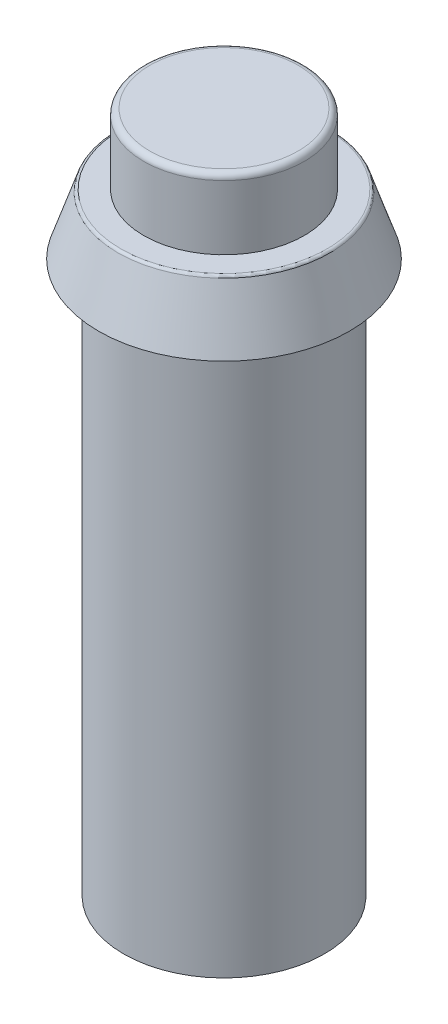
ISO-10303-21;
HEADER;
FILE_DESCRIPTION(('STEP AP214'),'2;1');
FILE_NAME('part.step','',(''),(''),'','','');
FILE_SCHEMA(('AUTOMOTIVE_DESIGN { 1 0 10303 214 1 1 1 1 }'));
ENDSEC;
DATA;
#1=APPLICATION_CONTEXT('core data for automotive mechanical design processes');
#2=APPLICATION_PROTOCOL_DEFINITION('international standard','automotive_design',2000,#1);
#3=PRODUCT_CONTEXT('',#1,'mechanical');
#4=PRODUCT('Part','Part','',(#3));
#5=PRODUCT_RELATED_PRODUCT_CATEGORY('part','',(#4));
#6=PRODUCT_DEFINITION_FORMATION('','',#4);
#7=PRODUCT_DEFINITION_CONTEXT('part definition',#1,'design');
#8=PRODUCT_DEFINITION('design','',#6,#7);
#9=PRODUCT_DEFINITION_SHAPE('','',#8);
#10=(LENGTH_UNIT() NAMED_UNIT(*) SI_UNIT(.MILLI.,.METRE.));
#11=(NAMED_UNIT(*) PLANE_ANGLE_UNIT() SI_UNIT($,.RADIAN.));
#12=(NAMED_UNIT(*) SI_UNIT($,.STERADIAN.) SOLID_ANGLE_UNIT());
#13=UNCERTAINTY_MEASURE_WITH_UNIT(LENGTH_MEASURE(1.E-05),#10,'distance_accuracy_value','');
#14=(GEOMETRIC_REPRESENTATION_CONTEXT(3) GLOBAL_UNCERTAINTY_ASSIGNED_CONTEXT((#13)) GLOBAL_UNIT_ASSIGNED_CONTEXT((#10,
#11,#12)) REPRESENTATION_CONTEXT('',''));
#15=CARTESIAN_POINT('',(0.,0.,0.));
#16=DIRECTION('',(0.,0.,1.));
#17=DIRECTION('',(1.,0.,0.));
#18=AXIS2_PLACEMENT_3D('',#15,#16,#17);
#19=CARTESIAN_POINT('',(0.,27.5,0.));
#20=DIRECTION('',(0.,-1.,0.));
#21=DIRECTION('',(0.,0.,-1.));
#22=AXIS2_PLACEMENT_3D('',#19,#20,#21);
#23=CYLINDRICAL_SURFACE('',#22,5.);
#24=CARTESIAN_POINT('',(0.,27.5,0.));
#25=DIRECTION('',(0.,1.,0.));
#26=DIRECTION('',(0.,0.,1.));
#27=AXIS2_PLACEMENT_3D('',#24,#25,#26);
#28=CIRCLE('',#27,5.);
#29=CARTESIAN_POINT('',(0.,27.5,5.));
#30=VERTEX_POINT('',#29);
#31=EDGE_CURVE('E72',#30,#30,#28,.T.);
#32=ORIENTED_EDGE('',*,*,#31,.F.);
#33=EDGE_LOOP('',(#32));
#34=FACE_BOUND('',#33,.T.);
#35=CARTESIAN_POINT('',(0.,0.,0.));
#36=DIRECTION('',(0.,1.,0.));
#37=DIRECTION('',(0.,0.,1.));
#38=AXIS2_PLACEMENT_3D('',#35,#36,#37);
#39=CIRCLE('',#38,5.);
#40=CARTESIAN_POINT('',(0.,0.,5.));
#41=VERTEX_POINT('',#40);
#42=EDGE_CURVE('E68',#41,#41,#39,.T.);
#43=ORIENTED_EDGE('',*,*,#42,.T.);
#44=EDGE_LOOP('',(#43));
#45=FACE_BOUND('',#44,.T.);
#46=ADVANCED_FACE('F43',(#34,#45),#23,.T.);
#47=CARTESIAN_POINT('',(0.,0.,0.));
#48=DIRECTION('',(0.,1.,0.));
#49=DIRECTION('',(0.,0.,1.));
#50=AXIS2_PLACEMENT_3D('',#47,#48,#49);
#51=PLANE('',#50);
#52=ORIENTED_EDGE('',*,*,#42,.F.);
#53=EDGE_LOOP('',(#52));
#54=FACE_BOUND('',#53,.T.);
#55=ADVANCED_FACE('F89',(#54),#51,.F.);
#56=CARTESIAN_POINT('',(0.,30.5,0.));
#57=DIRECTION('',(0.,1.,0.));
#58=DIRECTION('',(0.,0.,1.));
#59=AXIS2_PLACEMENT_3D('',#56,#57,#58);
#60=PLANE('',#59);
#61=CARTESIAN_POINT('',(0.,30.5,0.));
#62=DIRECTION('',(0.,1.,0.));
#63=DIRECTION('',(0.,0.,1.));
#64=AXIS2_PLACEMENT_3D('',#61,#62,#63);
#65=CIRCLE('',#64,5.14188611699158);
#66=CARTESIAN_POINT('',(0.,30.5,5.14188611699158));
#67=VERTEX_POINT('',#66);
#68=EDGE_CURVE('E51',#67,#67,#65,.T.);
#69=ORIENTED_EDGE('',*,*,#68,.T.);
#70=EDGE_LOOP('',(#69));
#71=FACE_BOUND('',#70,.T.);
#72=CARTESIAN_POINT('',(0.,30.5,0.));
#73=DIRECTION('',(0.,1.,0.));
#74=DIRECTION('',(0.,0.,1.));
#75=AXIS2_PLACEMENT_3D('',#72,#73,#74);
#76=CIRCLE('',#75,4.);
#77=CARTESIAN_POINT('',(0.,30.5,4.));
#78=VERTEX_POINT('',#77);
#79=EDGE_CURVE('E67',#78,#78,#76,.T.);
#80=ORIENTED_EDGE('',*,*,#79,.F.);
#81=EDGE_LOOP('',(#80));
#82=FACE_BOUND('',#81,.T.);
#83=ADVANCED_FACE('F86',(#71,#82),#60,.T.);
#84=CARTESIAN_POINT('',(0.,27.5,0.));
#85=DIRECTION('',(0.,1.,0.));
#86=DIRECTION('',(0.,0.,1.));
#87=AXIS2_PLACEMENT_3D('',#84,#85,#86);
#88=PLANE('',#87);
#89=ORIENTED_EDGE('',*,*,#31,.T.);
#90=EDGE_LOOP('',(#89));
#91=FACE_BOUND('',#90,.T.);
#92=CARTESIAN_POINT('',(0.,27.5,0.));
#93=DIRECTION('',(0.,1.,0.));
#94=DIRECTION('',(0.,0.,1.));
#95=AXIS2_PLACEMENT_3D('',#92,#93,#94);
#96=CIRCLE('',#95,6.25);
#97=CARTESIAN_POINT('',(0.,27.5,6.25));
#98=VERTEX_POINT('',#97);
#99=EDGE_CURVE('E73',#98,#98,#96,.T.);
#100=ORIENTED_EDGE('',*,*,#99,.F.);
#101=EDGE_LOOP('',(#100));
#102=FACE_BOUND('',#101,.T.);
#103=ADVANCED_FACE('F88',(#91,#102),#88,.F.);
#104=CARTESIAN_POINT('',(0.,34.,0.));
#105=DIRECTION('',(0.,-1.,0.));
#106=DIRECTION('',(0.,0.,-1.));
#107=AXIS2_PLACEMENT_3D('',#104,#105,#106);
#108=CYLINDRICAL_SURFACE('',#107,4.);
#109=CARTESIAN_POINT('',(0.,33.7,0.));
#110=DIRECTION('',(0.,1.,0.));
#111=DIRECTION('',(0.,0.,1.));
#112=AXIS2_PLACEMENT_3D('',#109,#110,#111);
#113=CIRCLE('',#112,4.);
#114=CARTESIAN_POINT('',(0.,33.7,4.));
#115=VERTEX_POINT('',#114);
#116=EDGE_CURVE('E56',#115,#115,#113,.F.);
#117=ORIENTED_EDGE('',*,*,#116,.T.);
#118=EDGE_LOOP('',(#117));
#119=FACE_BOUND('',#118,.T.);
#120=ORIENTED_EDGE('',*,*,#79,.T.);
#121=EDGE_LOOP('',(#120));
#122=FACE_BOUND('',#121,.T.);
#123=ADVANCED_FACE('F84',(#119,#122),#108,.T.);
#124=CARTESIAN_POINT('',(0.,34.,0.));
#125=DIRECTION('',(0.,1.,0.));
#126=DIRECTION('',(0.,0.,1.));
#127=AXIS2_PLACEMENT_3D('',#124,#125,#126);
#128=PLANE('',#127);
#129=CARTESIAN_POINT('',(0.,34.,0.));
#130=DIRECTION('',(0.,1.,0.));
#131=DIRECTION('',(0.,0.,1.));
#132=AXIS2_PLACEMENT_3D('',#129,#130,#131);
#133=CIRCLE('',#132,3.7);
#134=CARTESIAN_POINT('',(0.,34.,3.7));
#135=VERTEX_POINT('',#134);
#136=EDGE_CURVE('E61',#135,#135,#133,.T.);
#137=ORIENTED_EDGE('',*,*,#136,.T.);
#138=EDGE_LOOP('',(#137));
#139=FACE_BOUND('',#138,.T.);
#140=ADVANCED_FACE('F114',(#139),#128,.T.);
#141=CARTESIAN_POINT('',(0.,30.5,0.));
#142=DIRECTION('',(0.,-1.,0.));
#143=DIRECTION('',(0.,0.,-1.));
#144=AXIS2_PLACEMENT_3D('',#141,#142,#143);
#145=CONICAL_SURFACE('',#144,5.25,0.321750554396639);
#146=CARTESIAN_POINT('',(0.,30.3974341649025,0.));
#147=DIRECTION('',(0.,1.,0.));
#148=DIRECTION('',(0.,0.,1.));
#149=AXIS2_PLACEMENT_3D('',#146,#147,#148);
#150=CIRCLE('',#149,5.28418861169916);
#151=CARTESIAN_POINT('',(0.,30.3974341649025,5.28418861169916));
#152=VERTEX_POINT('',#151);
#153=EDGE_CURVE('E10',#152,#152,#150,.F.);
#154=ORIENTED_EDGE('',*,*,#153,.T.);
#155=EDGE_LOOP('',(#154));
#156=FACE_BOUND('',#155,.T.);
#157=ORIENTED_EDGE('',*,*,#99,.T.);
#158=EDGE_LOOP('',(#157));
#159=FACE_BOUND('',#158,.T.);
#160=ADVANCED_FACE('F109',(#156,#159),#145,.T.);
#161=CARTESIAN_POINT('',(0.,33.7,0.));
#162=DIRECTION('',(0.,1.,0.));
#163=DIRECTION('',(0.,0.,1.));
#164=AXIS2_PLACEMENT_3D('',#161,#162,#163);
#165=TOROIDAL_SURFACE('',#164,3.7,0.3);
#166=ORIENTED_EDGE('',*,*,#116,.F.);
#167=EDGE_LOOP('',(#166));
#168=FACE_BOUND('',#167,.T.);
#169=ORIENTED_EDGE('',*,*,#136,.F.);
#170=EDGE_LOOP('',(#169));
#171=FACE_BOUND('',#170,.T.);
#172=ADVANCED_FACE('F113',(#168,#171),#165,.T.);
#173=CARTESIAN_POINT('',(0.,30.35,0.));
#174=DIRECTION('',(0.,1.,0.));
#175=DIRECTION('',(0.,0.,1.));
#176=AXIS2_PLACEMENT_3D('',#173,#174,#175);
#177=TOROIDAL_SURFACE('',#176,5.14188611699158,0.15);
#178=ORIENTED_EDGE('',*,*,#153,.F.);
#179=EDGE_LOOP('',(#178));
#180=FACE_BOUND('',#179,.T.);
#181=ORIENTED_EDGE('',*,*,#68,.F.);
#182=EDGE_LOOP('',(#181));
#183=FACE_BOUND('',#182,.T.);
#184=ADVANCED_FACE('F45',(#180,#183),#177,.T.);
#185=CLOSED_SHELL('',(#46,#55,#83,#103,#123,#140,#160,#172,#184));
#186=MANIFOLD_SOLID_BREP('B2',#185);
#187=ADVANCED_BREP_SHAPE_REPRESENTATION('',(#18,#186),#14);
#188=SHAPE_DEFINITION_REPRESENTATION(#9,#187);
ENDSEC;
END-ISO-10303-21;
